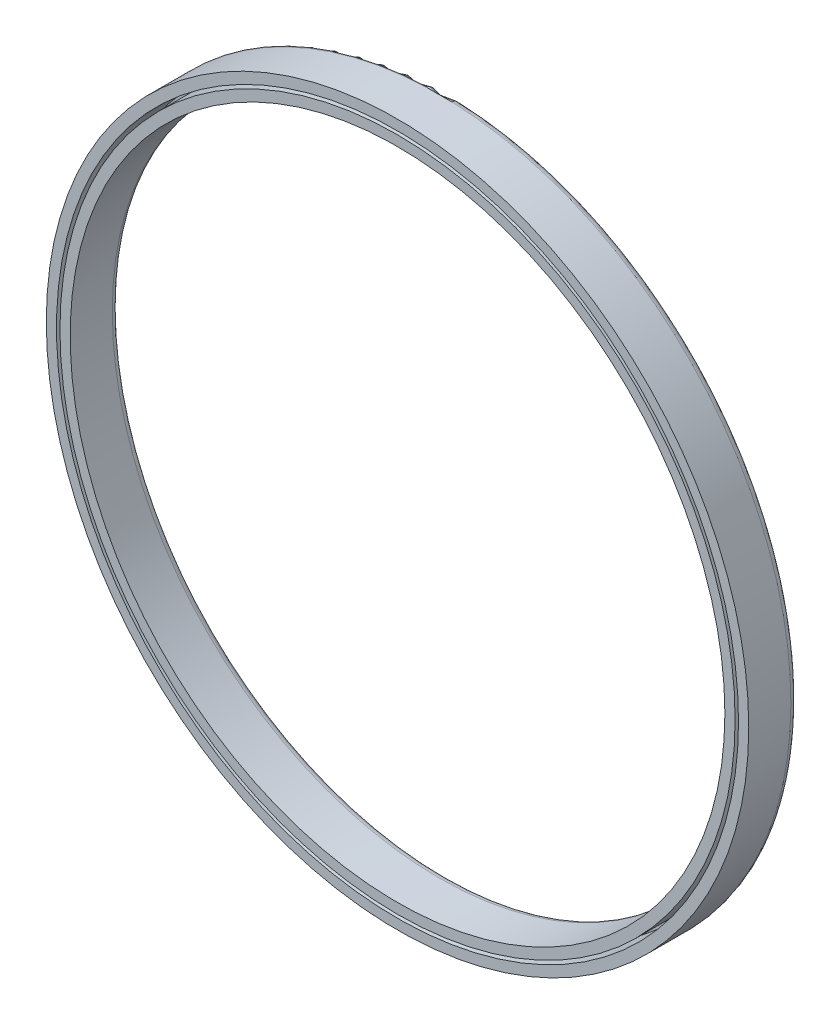
ISO-10303-21;
HEADER;
FILE_DESCRIPTION(('STEP AP214'),'2;1');
FILE_NAME('part.step','',(''),(''),'','','');
FILE_SCHEMA(('AUTOMOTIVE_DESIGN { 1 0 10303 214 1 1 1 1 }'));
ENDSEC;
DATA;
#1=APPLICATION_CONTEXT('core data for automotive mechanical design processes');
#2=APPLICATION_PROTOCOL_DEFINITION('international standard','automotive_design',2000,#1);
#3=PRODUCT_CONTEXT('',#1,'mechanical');
#4=PRODUCT('Part','Part','',(#3));
#5=PRODUCT_RELATED_PRODUCT_CATEGORY('part','',(#4));
#6=PRODUCT_DEFINITION_FORMATION('','',#4);
#7=PRODUCT_DEFINITION_CONTEXT('part definition',#1,'design');
#8=PRODUCT_DEFINITION('design','',#6,#7);
#9=PRODUCT_DEFINITION_SHAPE('','',#8);
#10=(LENGTH_UNIT() NAMED_UNIT(*) SI_UNIT(.MILLI.,.METRE.));
#11=(NAMED_UNIT(*) PLANE_ANGLE_UNIT() SI_UNIT($,.RADIAN.));
#12=(NAMED_UNIT(*) SI_UNIT($,.STERADIAN.) SOLID_ANGLE_UNIT());
#13=UNCERTAINTY_MEASURE_WITH_UNIT(LENGTH_MEASURE(1.E-05),#10,'distance_accuracy_value','');
#14=(GEOMETRIC_REPRESENTATION_CONTEXT(3) GLOBAL_UNCERTAINTY_ASSIGNED_CONTEXT((#13)) GLOBAL_UNIT_ASSIGNED_CONTEXT((#10,
#11,#12)) REPRESENTATION_CONTEXT('',''));
#15=CARTESIAN_POINT('',(0.,0.,0.));
#16=DIRECTION('',(0.,0.,1.));
#17=DIRECTION('',(1.,0.,0.));
#18=AXIS2_PLACEMENT_3D('',#15,#16,#17);
#19=CARTESIAN_POINT('',(0.,0.,-12.3555787278415));
#20=DIRECTION('',(0.,0.,-1.));
#21=DIRECTION('',(-1.,0.,0.));
#22=AXIS2_PLACEMENT_3D('',#19,#20,#21);
#23=TOROIDAL_SURFACE('',#22,98.,2.);
#24=CARTESIAN_POINT('',(0.,0.,-12.3555787278415));
#25=DIRECTION('',(0.,0.,-1.));
#26=DIRECTION('',(-1.,0.,0.));
#27=AXIS2_PLACEMENT_3D('',#24,#25,#26);
#28=CIRCLE('',#27,96.);
#29=CARTESIAN_POINT('',(-96.,0.,-12.3555787278415));
#30=VERTEX_POINT('',#29);
#31=EDGE_CURVE('E37',#30,#30,#28,.T.);
#32=ORIENTED_EDGE('',*,*,#31,.F.);
#33=EDGE_LOOP('',(#32));
#34=FACE_BOUND('',#33,.T.);
#35=CARTESIAN_POINT('',(0.,0.,-14.3555787278415));
#36=DIRECTION('',(0.,0.,-1.));
#37=DIRECTION('',(-1.,0.,0.));
#38=AXIS2_PLACEMENT_3D('',#35,#36,#37);
#39=CIRCLE('',#38,98.);
#40=CARTESIAN_POINT('',(-98.,0.,-14.3555787278415));
#41=VERTEX_POINT('',#40);
#42=EDGE_CURVE('E10',#41,#41,#39,.F.);
#43=ORIENTED_EDGE('',*,*,#42,.F.);
#44=EDGE_LOOP('',(#43));
#45=FACE_BOUND('',#44,.T.);
#46=ADVANCED_FACE('F31',(#34,#45),#23,.T.);
#47=CARTESIAN_POINT('',(0.,0.,-12.3555787278415));
#48=DIRECTION('',(0.,0.,-1.));
#49=DIRECTION('',(-1.,0.,0.));
#50=AXIS2_PLACEMENT_3D('',#47,#48,#49);
#51=TOROIDAL_SURFACE('',#50,101.,2.);
#52=CARTESIAN_POINT('',(0.,0.,-14.3555787278415));
#53=DIRECTION('',(0.,0.,-1.));
#54=DIRECTION('',(-1.,0.,0.));
#55=AXIS2_PLACEMENT_3D('',#52,#53,#54);
#56=CIRCLE('',#55,101.);
#57=CARTESIAN_POINT('',(-101.,0.,-14.3555787278415));
#58=VERTEX_POINT('',#57);
#59=EDGE_CURVE('E45',#58,#58,#56,.T.);
#60=ORIENTED_EDGE('',*,*,#59,.F.);
#61=EDGE_LOOP('',(#60));
#62=FACE_BOUND('',#61,.T.);
#63=CARTESIAN_POINT('',(0.,0.,-12.3555787278415));
#64=DIRECTION('',(0.,0.,-1.));
#65=DIRECTION('',(-1.,0.,0.));
#66=AXIS2_PLACEMENT_3D('',#63,#64,#65);
#67=CIRCLE('',#66,103.);
#68=CARTESIAN_POINT('',(-103.,0.,-12.3555787278415));
#69=VERTEX_POINT('',#68);
#70=EDGE_CURVE('E41',#69,#69,#67,.F.);
#71=ORIENTED_EDGE('',*,*,#70,.F.);
#72=EDGE_LOOP('',(#71));
#73=FACE_BOUND('',#72,.T.);
#74=ADVANCED_FACE('F85',(#62,#73),#51,.T.);
#75=CARTESIAN_POINT('',(0.,0.,0.));
#76=DIRECTION('',(0.,0.,1.));
#77=DIRECTION('',(1.,0.,0.));
#78=AXIS2_PLACEMENT_3D('',#75,#76,#77);
#79=CYLINDRICAL_SURFACE('',#78,96.);
#80=ORIENTED_EDGE('',*,*,#31,.T.);
#81=EDGE_LOOP('',(#80));
#82=FACE_BOUND('',#81,.T.);
#83=CARTESIAN_POINT('',(0.,0.,0.));
#84=DIRECTION('',(0.,0.,1.));
#85=DIRECTION('',(1.,0.,0.));
#86=AXIS2_PLACEMENT_3D('',#83,#84,#85);
#87=CIRCLE('',#86,96.);
#88=CARTESIAN_POINT('',(96.,0.,0.));
#89=VERTEX_POINT('',#88);
#90=EDGE_CURVE('E50',#89,#89,#87,.T.);
#91=ORIENTED_EDGE('',*,*,#90,.T.);
#92=EDGE_LOOP('',(#91));
#93=FACE_BOUND('',#92,.T.);
#94=ADVANCED_FACE('F90',(#82,#93),#79,.F.);
#95=CARTESIAN_POINT('',(-96.,0.,0.));
#96=DIRECTION('',(0.,0.,1.));
#97=DIRECTION('',(1.,0.,0.));
#98=AXIS2_PLACEMENT_3D('',#95,#96,#97);
#99=PLANE('',#98);
#100=CARTESIAN_POINT('',(0.,0.,0.));
#101=DIRECTION('',(0.,0.,1.));
#102=DIRECTION('',(1.,0.,0.));
#103=AXIS2_PLACEMENT_3D('',#100,#101,#102);
#104=CIRCLE('',#103,99.);
#105=CARTESIAN_POINT('',(99.,0.,0.));
#106=VERTEX_POINT('',#105);
#107=EDGE_CURVE('E53',#106,#106,#104,.T.);
#108=ORIENTED_EDGE('',*,*,#107,.T.);
#109=EDGE_LOOP('',(#108));
#110=FACE_BOUND('',#109,.T.);
#111=ORIENTED_EDGE('',*,*,#90,.F.);
#112=EDGE_LOOP('',(#111));
#113=FACE_BOUND('',#112,.T.);
#114=ADVANCED_FACE('F96',(#110,#113),#99,.T.);
#115=CARTESIAN_POINT('',(0.,0.,0.));
#116=DIRECTION('',(0.,0.,1.));
#117=DIRECTION('',(1.,0.,0.));
#118=AXIS2_PLACEMENT_3D('',#115,#116,#117);
#119=CYLINDRICAL_SURFACE('',#118,99.);
#120=CARTESIAN_POINT('',(0.,0.,-11.3555787278415));
#121=DIRECTION('',(0.,0.,1.));
#122=DIRECTION('',(1.,0.,0.));
#123=AXIS2_PLACEMENT_3D('',#120,#121,#122);
#124=CIRCLE('',#123,99.);
#125=CARTESIAN_POINT('',(99.,0.,-11.3555787278415));
#126=VERTEX_POINT('',#125);
#127=EDGE_CURVE('E56',#126,#126,#124,.T.);
#128=ORIENTED_EDGE('',*,*,#127,.T.);
#129=EDGE_LOOP('',(#128));
#130=FACE_BOUND('',#129,.T.);
#131=ORIENTED_EDGE('',*,*,#107,.F.);
#132=EDGE_LOOP('',(#131));
#133=FACE_BOUND('',#132,.T.);
#134=ADVANCED_FACE('F103',(#130,#133),#119,.T.);
#135=CARTESIAN_POINT('',(-99.,0.,-11.3555787278415));
#136=DIRECTION('',(0.,0.,1.));
#137=DIRECTION('',(1.,0.,0.));
#138=AXIS2_PLACEMENT_3D('',#135,#136,#137);
#139=PLANE('',#138);
#140=CARTESIAN_POINT('',(0.,0.,-11.3555787278415));
#141=DIRECTION('',(0.,0.,1.));
#142=DIRECTION('',(1.,0.,0.));
#143=AXIS2_PLACEMENT_3D('',#140,#141,#142);
#144=CIRCLE('',#143,100.);
#145=CARTESIAN_POINT('',(100.,0.,-11.3555787278415));
#146=VERTEX_POINT('',#145);
#147=EDGE_CURVE('E59',#146,#146,#144,.T.);
#148=ORIENTED_EDGE('',*,*,#147,.T.);
#149=EDGE_LOOP('',(#148));
#150=FACE_BOUND('',#149,.T.);
#151=ORIENTED_EDGE('',*,*,#127,.F.);
#152=EDGE_LOOP('',(#151));
#153=FACE_BOUND('',#152,.T.);
#154=ADVANCED_FACE('F107',(#150,#153),#139,.T.);
#155=CARTESIAN_POINT('',(0.,0.,0.));
#156=DIRECTION('',(0.,0.,1.));
#157=DIRECTION('',(1.,0.,0.));
#158=AXIS2_PLACEMENT_3D('',#155,#156,#157);
#159=CYLINDRICAL_SURFACE('',#158,100.);
#160=CARTESIAN_POINT('',(0.,0.,0.));
#161=DIRECTION('',(0.,0.,1.));
#162=DIRECTION('',(1.,0.,0.));
#163=AXIS2_PLACEMENT_3D('',#160,#161,#162);
#164=CIRCLE('',#163,100.);
#165=CARTESIAN_POINT('',(100.,0.,0.));
#166=VERTEX_POINT('',#165);
#167=EDGE_CURVE('E62',#166,#166,#164,.T.);
#168=ORIENTED_EDGE('',*,*,#167,.T.);
#169=EDGE_LOOP('',(#168));
#170=FACE_BOUND('',#169,.T.);
#171=ORIENTED_EDGE('',*,*,#147,.F.);
#172=EDGE_LOOP('',(#171));
#173=FACE_BOUND('',#172,.T.);
#174=ADVANCED_FACE('F82',(#170,#173),#159,.F.);
#175=CARTESIAN_POINT('',(-100.,0.,0.));
#176=DIRECTION('',(0.,0.,1.));
#177=DIRECTION('',(1.,0.,0.));
#178=AXIS2_PLACEMENT_3D('',#175,#176,#177);
#179=PLANE('',#178);
#180=CARTESIAN_POINT('',(0.,0.,0.));
#181=DIRECTION('',(0.,0.,1.));
#182=DIRECTION('',(1.,0.,0.));
#183=AXIS2_PLACEMENT_3D('',#180,#181,#182);
#184=CIRCLE('',#183,103.);
#185=CARTESIAN_POINT('',(103.,0.,0.));
#186=VERTEX_POINT('',#185);
#187=EDGE_CURVE('E65',#186,#186,#184,.T.);
#188=ORIENTED_EDGE('',*,*,#187,.T.);
#189=EDGE_LOOP('',(#188));
#190=FACE_BOUND('',#189,.T.);
#191=ORIENTED_EDGE('',*,*,#167,.F.);
#192=EDGE_LOOP('',(#191));
#193=FACE_BOUND('',#192,.T.);
#194=ADVANCED_FACE('F69',(#190,#193),#179,.T.);
#195=CARTESIAN_POINT('',(0.,0.,0.));
#196=DIRECTION('',(0.,0.,1.));
#197=DIRECTION('',(1.,0.,0.));
#198=AXIS2_PLACEMENT_3D('',#195,#196,#197);
#199=CYLINDRICAL_SURFACE('',#198,103.);
#200=ORIENTED_EDGE('',*,*,#70,.T.);
#201=EDGE_LOOP('',(#200));
#202=FACE_BOUND('',#201,.T.);
#203=ORIENTED_EDGE('',*,*,#187,.F.);
#204=EDGE_LOOP('',(#203));
#205=FACE_BOUND('',#204,.T.);
#206=ADVANCED_FACE('F72',(#202,#205),#199,.T.);
#207=CARTESIAN_POINT('',(-103.,0.,-14.3555787278415));
#208=DIRECTION('',(0.,0.,-1.));
#209=DIRECTION('',(-1.,0.,0.));
#210=AXIS2_PLACEMENT_3D('',#207,#208,#209);
#211=PLANE('',#210);
#212=ORIENTED_EDGE('',*,*,#42,.T.);
#213=EDGE_LOOP('',(#212));
#214=FACE_BOUND('',#213,.T.);
#215=ORIENTED_EDGE('',*,*,#59,.T.);
#216=EDGE_LOOP('',(#215));
#217=FACE_BOUND('',#216,.T.);
#218=ADVANCED_FACE('F74',(#214,#217),#211,.T.);
#219=CLOSED_SHELL('',(#46,#74,#94,#114,#134,#154,#174,#194,#206,#218));
#220=MANIFOLD_SOLID_BREP('B2',#219);
#221=ADVANCED_BREP_SHAPE_REPRESENTATION('',(#18,#220),#14);
#222=SHAPE_DEFINITION_REPRESENTATION(#9,#221);
ENDSEC;
END-ISO-10303-21;
